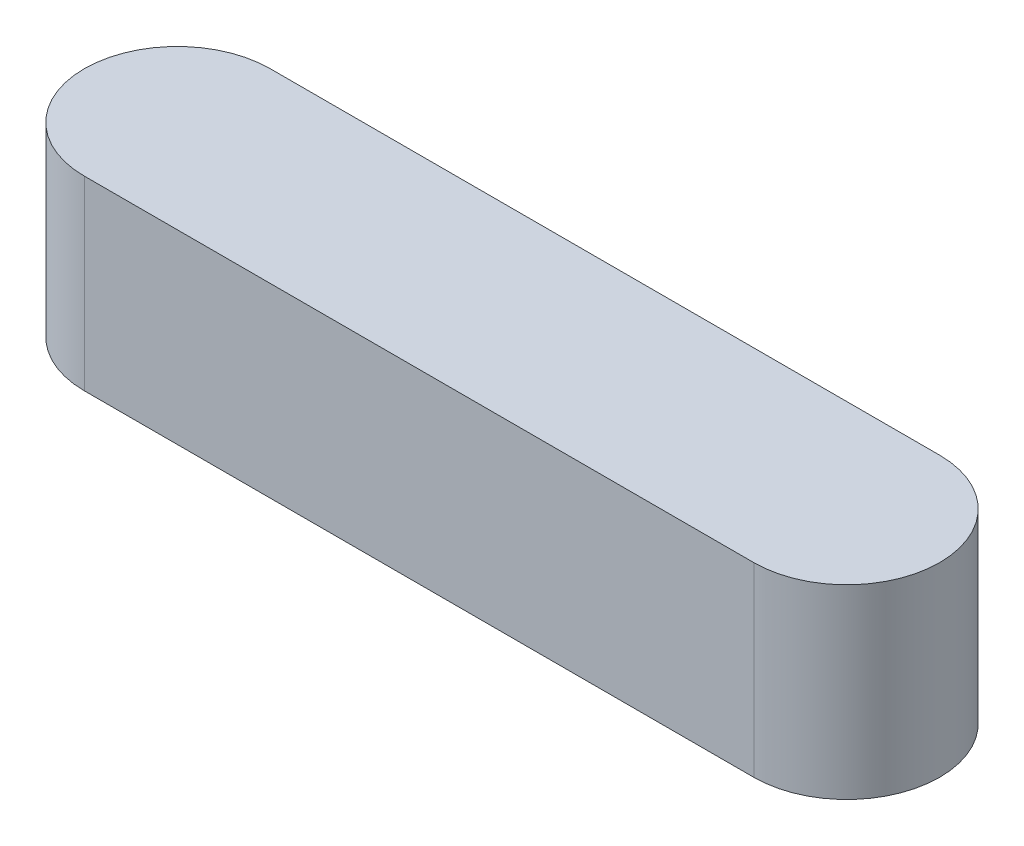
ISO-10303-21;
HEADER;
FILE_DESCRIPTION(('STEP AP214'),'2;1');
FILE_NAME('part.step','',(''),(''),'','','');
FILE_SCHEMA(('AUTOMOTIVE_DESIGN { 1 0 10303 214 1 1 1 1 }'));
ENDSEC;
DATA;
#1=APPLICATION_CONTEXT('core data for automotive mechanical design processes');
#2=APPLICATION_PROTOCOL_DEFINITION('international standard','automotive_design',2000,#1);
#3=PRODUCT_CONTEXT('',#1,'mechanical');
#4=PRODUCT('Part','Part','',(#3));
#5=PRODUCT_RELATED_PRODUCT_CATEGORY('part','',(#4));
#6=PRODUCT_DEFINITION_FORMATION('','',#4);
#7=PRODUCT_DEFINITION_CONTEXT('part definition',#1,'design');
#8=PRODUCT_DEFINITION('design','',#6,#7);
#9=PRODUCT_DEFINITION_SHAPE('','',#8);
#10=(LENGTH_UNIT() NAMED_UNIT(*) SI_UNIT(.MILLI.,.METRE.));
#11=(NAMED_UNIT(*) PLANE_ANGLE_UNIT() SI_UNIT($,.RADIAN.));
#12=(NAMED_UNIT(*) SI_UNIT($,.STERADIAN.) SOLID_ANGLE_UNIT());
#13=UNCERTAINTY_MEASURE_WITH_UNIT(LENGTH_MEASURE(1.E-05),#10,'distance_accuracy_value','');
#14=(GEOMETRIC_REPRESENTATION_CONTEXT(3) GLOBAL_UNCERTAINTY_ASSIGNED_CONTEXT((#13)) GLOBAL_UNIT_ASSIGNED_CONTEXT((#10,
#11,#12)) REPRESENTATION_CONTEXT('',''));
#15=CARTESIAN_POINT('',(0.,0.,0.));
#16=DIRECTION('',(0.,0.,1.));
#17=DIRECTION('',(1.,0.,0.));
#18=AXIS2_PLACEMENT_3D('',#15,#16,#17);
#19=CARTESIAN_POINT('',(-9.,2.5,0.));
#20=DIRECTION('',(0.,-1.,0.));
#21=DIRECTION('',(0.,0.,-1.));
#22=AXIS2_PLACEMENT_3D('',#19,#20,#21);
#23=CYLINDRICAL_SURFACE('',#22,2.5);
#24=CARTESIAN_POINT('',(-9.,-2.5,0.));
#25=DIRECTION('',(0.,1.,0.));
#26=DIRECTION('',(0.,0.,1.));
#27=AXIS2_PLACEMENT_3D('',#24,#25,#26);
#28=CIRCLE('',#27,2.5);
#29=CARTESIAN_POINT('',(-9.,-2.5,-2.5));
#30=VERTEX_POINT('',#29);
#31=CARTESIAN_POINT('',(-9.,-2.5,2.5));
#32=VERTEX_POINT('',#31);
#33=EDGE_CURVE('E95',#30,#32,#28,.T.);
#34=ORIENTED_EDGE('',*,*,#33,.T.);
#35=DIRECTION('',(0.,-1.,0.));
#36=VECTOR('',#35,1.);
#37=CARTESIAN_POINT('',(-9.,2.5,2.5));
#38=LINE('',#37,#36);
#39=CARTESIAN_POINT('',(-9.,2.5,2.5));
#40=VERTEX_POINT('',#39);
#41=EDGE_CURVE('E11',#40,#32,#38,.T.);
#42=ORIENTED_EDGE('',*,*,#41,.F.);
#43=CARTESIAN_POINT('',(-9.,2.5,0.));
#44=DIRECTION('',(0.,1.,0.));
#45=DIRECTION('',(0.,0.,1.));
#46=AXIS2_PLACEMENT_3D('',#43,#44,#45);
#47=CIRCLE('',#46,2.5);
#48=CARTESIAN_POINT('',(-9.,2.5,-2.5));
#49=VERTEX_POINT('',#48);
#50=EDGE_CURVE('E83',#49,#40,#47,.T.);
#51=ORIENTED_EDGE('',*,*,#50,.F.);
#52=DIRECTION('',(0.,-1.,0.));
#53=VECTOR('',#52,1.);
#54=CARTESIAN_POINT('',(-9.,2.5,-2.5));
#55=LINE('',#54,#53);
#56=EDGE_CURVE('E91',#49,#30,#55,.T.);
#57=ORIENTED_EDGE('',*,*,#56,.T.);
#58=EDGE_LOOP('',(#34,#42,#51,#57));
#59=FACE_BOUND('',#58,.T.);
#60=ADVANCED_FACE('F32',(#59),#23,.T.);
#61=CARTESIAN_POINT('',(-9.,2.5,2.5));
#62=DIRECTION('',(0.,0.,-1.));
#63=DIRECTION('',(-1.,0.,0.));
#64=AXIS2_PLACEMENT_3D('',#61,#62,#63);
#65=PLANE('',#64);
#66=DIRECTION('',(1.,0.,0.));
#67=VECTOR('',#66,1.);
#68=CARTESIAN_POINT('',(-9.,-2.5,2.5));
#69=LINE('',#68,#67);
#70=CARTESIAN_POINT('',(9.,-2.5,2.5));
#71=VERTEX_POINT('',#70);
#72=EDGE_CURVE('E87',#32,#71,#69,.T.);
#73=ORIENTED_EDGE('',*,*,#72,.T.);
#74=DIRECTION('',(0.,-1.,0.));
#75=VECTOR('',#74,1.);
#76=CARTESIAN_POINT('',(9.,2.5,2.5));
#77=LINE('',#76,#75);
#78=CARTESIAN_POINT('',(9.,2.5,2.5));
#79=VERTEX_POINT('',#78);
#80=EDGE_CURVE('E40',#79,#71,#77,.T.);
#81=ORIENTED_EDGE('',*,*,#80,.F.);
#82=DIRECTION('',(1.,0.,0.));
#83=VECTOR('',#82,1.);
#84=CARTESIAN_POINT('',(-9.,2.5,2.5));
#85=LINE('',#84,#83);
#86=EDGE_CURVE('E78',#40,#79,#85,.T.);
#87=ORIENTED_EDGE('',*,*,#86,.F.);
#88=ORIENTED_EDGE('',*,*,#41,.T.);
#89=EDGE_LOOP('',(#73,#81,#87,#88));
#90=FACE_BOUND('',#89,.T.);
#91=ADVANCED_FACE('F86',(#90),#65,.F.);
#92=CARTESIAN_POINT('',(9.,2.5,0.));
#93=DIRECTION('',(0.,-1.,0.));
#94=DIRECTION('',(0.,0.,-1.));
#95=AXIS2_PLACEMENT_3D('',#92,#93,#94);
#96=CYLINDRICAL_SURFACE('',#95,2.5);
#97=CARTESIAN_POINT('',(9.,-2.5,0.));
#98=DIRECTION('',(0.,1.,0.));
#99=DIRECTION('',(0.,0.,1.));
#100=AXIS2_PLACEMENT_3D('',#97,#98,#99);
#101=CIRCLE('',#100,2.5);
#102=CARTESIAN_POINT('',(9.,-2.5,-2.5));
#103=VERTEX_POINT('',#102);
#104=EDGE_CURVE('E65',#71,#103,#101,.T.);
#105=ORIENTED_EDGE('',*,*,#104,.T.);
#106=DIRECTION('',(0.,-1.,0.));
#107=VECTOR('',#106,1.);
#108=CARTESIAN_POINT('',(9.,2.5,-2.5));
#109=LINE('',#108,#107);
#110=CARTESIAN_POINT('',(9.,2.5,-2.5));
#111=VERTEX_POINT('',#110);
#112=EDGE_CURVE('E88',#111,#103,#109,.T.);
#113=ORIENTED_EDGE('',*,*,#112,.F.);
#114=CARTESIAN_POINT('',(9.,2.5,0.));
#115=DIRECTION('',(0.,1.,0.));
#116=DIRECTION('',(0.,0.,1.));
#117=AXIS2_PLACEMENT_3D('',#114,#115,#116);
#118=CIRCLE('',#117,2.5);
#119=EDGE_CURVE('E81',#79,#111,#118,.T.);
#120=ORIENTED_EDGE('',*,*,#119,.F.);
#121=ORIENTED_EDGE('',*,*,#80,.T.);
#122=EDGE_LOOP('',(#105,#113,#120,#121));
#123=FACE_BOUND('',#122,.T.);
#124=ADVANCED_FACE('F89',(#123),#96,.T.);
#125=CARTESIAN_POINT('',(-9.,2.5,-2.5));
#126=DIRECTION('',(0.,0.,1.));
#127=DIRECTION('',(1.,0.,0.));
#128=AXIS2_PLACEMENT_3D('',#125,#126,#127);
#129=PLANE('',#128);
#130=DIRECTION('',(-1.,0.,0.));
#131=VECTOR('',#130,1.);
#132=CARTESIAN_POINT('',(-9.,-2.5,-2.5));
#133=LINE('',#132,#131);
#134=EDGE_CURVE('E71',#103,#30,#133,.T.);
#135=ORIENTED_EDGE('',*,*,#134,.T.);
#136=ORIENTED_EDGE('',*,*,#56,.F.);
#137=DIRECTION('',(-1.,0.,0.));
#138=VECTOR('',#137,1.);
#139=CARTESIAN_POINT('',(-9.,2.5,-2.5));
#140=LINE('',#139,#138);
#141=EDGE_CURVE('E48',#111,#49,#140,.T.);
#142=ORIENTED_EDGE('',*,*,#141,.F.);
#143=ORIENTED_EDGE('',*,*,#112,.T.);
#144=EDGE_LOOP('',(#135,#136,#142,#143));
#145=FACE_BOUND('',#144,.T.);
#146=ADVANCED_FACE('F102',(#145),#129,.F.);
#147=CARTESIAN_POINT('',(-9.,2.5,0.));
#148=DIRECTION('',(0.,1.,0.));
#149=DIRECTION('',(0.,0.,1.));
#150=AXIS2_PLACEMENT_3D('',#147,#148,#149);
#151=PLANE('',#150);
#152=ORIENTED_EDGE('',*,*,#50,.T.);
#153=ORIENTED_EDGE('',*,*,#86,.T.);
#154=ORIENTED_EDGE('',*,*,#119,.T.);
#155=ORIENTED_EDGE('',*,*,#141,.T.);
#156=EDGE_LOOP('',(#152,#153,#154,#155));
#157=FACE_BOUND('',#156,.T.);
#158=ADVANCED_FACE('F79',(#157),#151,.T.);
#159=CARTESIAN_POINT('',(-9.,-2.5,0.));
#160=DIRECTION('',(0.,1.,0.));
#161=DIRECTION('',(0.,0.,1.));
#162=AXIS2_PLACEMENT_3D('',#159,#160,#161);
#163=PLANE('',#162);
#164=ORIENTED_EDGE('',*,*,#33,.F.);
#165=ORIENTED_EDGE('',*,*,#134,.F.);
#166=ORIENTED_EDGE('',*,*,#104,.F.);
#167=ORIENTED_EDGE('',*,*,#72,.F.);
#168=EDGE_LOOP('',(#164,#165,#166,#167));
#169=FACE_BOUND('',#168,.T.);
#170=ADVANCED_FACE('F105',(#169),#163,.F.);
#171=CLOSED_SHELL('',(#60,#91,#124,#146,#158,#170));
#172=MANIFOLD_SOLID_BREP('B2',#171);
#173=ADVANCED_BREP_SHAPE_REPRESENTATION('',(#18,#172),#14);
#174=SHAPE_DEFINITION_REPRESENTATION(#9,#173);
ENDSEC;
END-ISO-10303-21;
